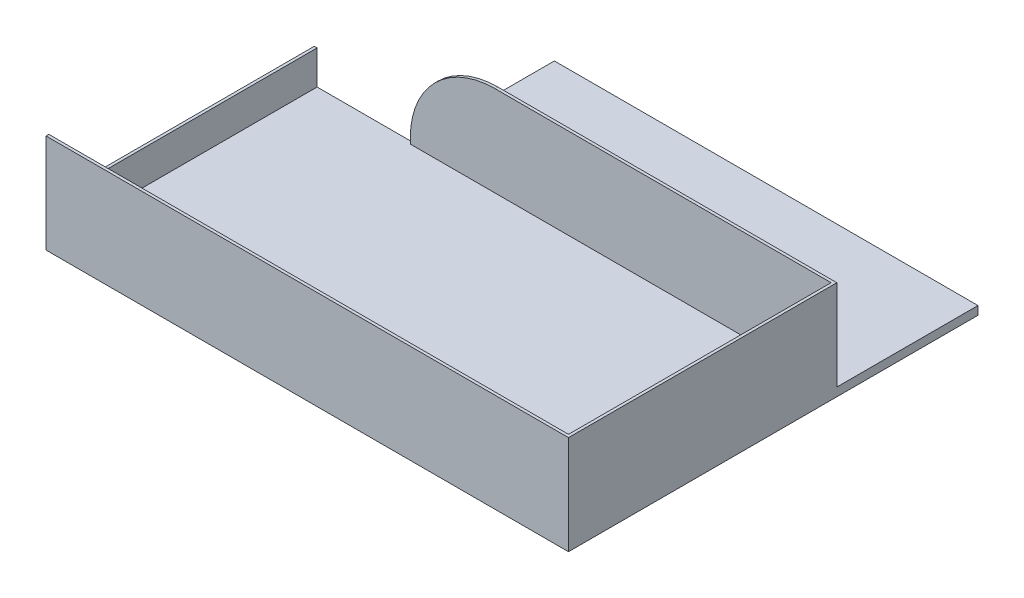
ISO-10303-21;
HEADER;
FILE_DESCRIPTION(('STEP AP214'),'2;1');
FILE_NAME('part.step','',(''),(''),'','','');
FILE_SCHEMA(('AUTOMOTIVE_DESIGN { 1 0 10303 214 1 1 1 1 }'));
ENDSEC;
DATA;
#1=APPLICATION_CONTEXT('core data for automotive mechanical design processes');
#2=APPLICATION_PROTOCOL_DEFINITION('international standard','automotive_design',2000,#1);
#3=PRODUCT_CONTEXT('',#1,'mechanical');
#4=PRODUCT('Part','Part','',(#3));
#5=PRODUCT_RELATED_PRODUCT_CATEGORY('part','',(#4));
#6=PRODUCT_DEFINITION_FORMATION('','',#4);
#7=PRODUCT_DEFINITION_CONTEXT('part definition',#1,'design');
#8=PRODUCT_DEFINITION('design','',#6,#7);
#9=PRODUCT_DEFINITION_SHAPE('','',#8);
#10=(LENGTH_UNIT() NAMED_UNIT(*) SI_UNIT(.MILLI.,.METRE.));
#11=(NAMED_UNIT(*) PLANE_ANGLE_UNIT() SI_UNIT($,.RADIAN.));
#12=(NAMED_UNIT(*) SI_UNIT($,.STERADIAN.) SOLID_ANGLE_UNIT());
#13=UNCERTAINTY_MEASURE_WITH_UNIT(LENGTH_MEASURE(1.E-05),#10,'distance_accuracy_value','');
#14=(GEOMETRIC_REPRESENTATION_CONTEXT(3) GLOBAL_UNCERTAINTY_ASSIGNED_CONTEXT((#13)) GLOBAL_UNIT_ASSIGNED_CONTEXT((#10,
#11,#12)) REPRESENTATION_CONTEXT('',''));
#15=CARTESIAN_POINT('',(0.,0.,0.));
#16=DIRECTION('',(0.,0.,1.));
#17=DIRECTION('',(1.,0.,0.));
#18=AXIS2_PLACEMENT_3D('',#15,#16,#17);
#19=CARTESIAN_POINT('',(0.,30.,0.));
#20=DIRECTION('',(0.,-1.,0.));
#21=DIRECTION('',(0.,0.,1.));
#22=AXIS2_PLACEMENT_3D('',#19,#20,#21);
#23=PLANE('',#22);
#24=DIRECTION('',(0.,0.,1.));
#25=VECTOR('',#24,1.);
#26=CARTESIAN_POINT('',(10.,30.,0.));
#27=LINE('',#26,#25);
#28=CARTESIAN_POINT('',(10.0000000000001,30.,-950.));
#29=VERTEX_POINT('',#28);
#30=CARTESIAN_POINT('',(10.,30.,-10.));
#31=VERTEX_POINT('',#30);
#32=EDGE_CURVE('E149',#29,#31,#27,.T.);
#33=ORIENTED_EDGE('',*,*,#32,.T.);
#34=DIRECTION('',(1.,0.,0.));
#35=VECTOR('',#34,1.);
#36=CARTESIAN_POINT('',(0.,30.,-10.));
#37=LINE('',#36,#35);
#38=CARTESIAN_POINT('',(1840.,30.,-10.));
#39=VERTEX_POINT('',#38);
#40=EDGE_CURVE('E236',#31,#39,#37,.T.);
#41=ORIENTED_EDGE('',*,*,#40,.T.);
#42=DIRECTION('',(0.,0.,-1.));
#43=VECTOR('',#42,1.);
#44=CARTESIAN_POINT('',(1840.,30.,0.));
#45=LINE('',#44,#43);
#46=CARTESIAN_POINT('',(1840.,30.,-940.));
#47=VERTEX_POINT('',#46);
#48=EDGE_CURVE('E233',#39,#47,#45,.T.);
#49=ORIENTED_EDGE('',*,*,#48,.T.);
#50=DIRECTION('',(1.,0.,0.));
#51=VECTOR('',#50,1.);
#52=CARTESIAN_POINT('',(350.,30.,-940.));
#53=LINE('',#52,#51);
#54=CARTESIAN_POINT('',(350.,30.,-940.));
#55=VERTEX_POINT('',#54);
#56=EDGE_CURVE('E163',#55,#47,#53,.T.);
#57=ORIENTED_EDGE('',*,*,#56,.F.);
#58=DIRECTION('',(0.,0.,-1.));
#59=VECTOR('',#58,1.);
#60=CARTESIAN_POINT('',(350.,30.,-940.));
#61=LINE('',#60,#59);
#62=CARTESIAN_POINT('',(350.,30.,-950.));
#63=VERTEX_POINT('',#62);
#64=EDGE_CURVE('E173',#55,#63,#61,.T.);
#65=ORIENTED_EDGE('',*,*,#64,.T.);
#66=DIRECTION('',(1.,0.,0.));
#67=VECTOR('',#66,1.);
#68=CARTESIAN_POINT('',(1.16341445918999E-13,30.,-950.));
#69=LINE('',#68,#67);
#70=EDGE_CURVE('E240',#29,#63,#69,.T.);
#71=ORIENTED_EDGE('',*,*,#70,.F.);
#72=EDGE_LOOP('',(#33,#41,#49,#57,#65,#71));
#73=FACE_BOUND('',#72,.T.);
#74=ADVANCED_FACE('F37',(#73),#23,.F.);
#75=DIRECTION('',(1.,0.,0.));
#76=VECTOR('',#75,1.);
#77=CARTESIAN_POINT('',(0.,30.,-950.));
#78=LINE('',#77,#76);
#79=CARTESIAN_POINT('',(1850.,30.,-950.));
#80=VERTEX_POINT('',#79);
#81=EDGE_CURVE('E195',#63,#80,#78,.T.);
#82=ORIENTED_EDGE('',*,*,#81,.T.);
#83=DIRECTION('',(0.,0.,-1.));
#84=VECTOR('',#83,1.);
#85=CARTESIAN_POINT('',(1850.,30.,-8.21565038222617E-13));
#86=LINE('',#85,#84);
#87=CARTESIAN_POINT('',(1850.,30.,-1450.));
#88=VERTEX_POINT('',#87);
#89=EDGE_CURVE('E190',#80,#88,#86,.T.);
#90=ORIENTED_EDGE('',*,*,#89,.T.);
#91=DIRECTION('',(-1.,0.,0.));
#92=VECTOR('',#91,1.);
#93=CARTESIAN_POINT('',(2.14643118094197E-13,30.,-1450.));
#94=LINE('',#93,#92);
#95=CARTESIAN_POINT('',(350.,30.,-1450.));
#96=VERTEX_POINT('',#95);
#97=EDGE_CURVE('E187',#88,#96,#94,.T.);
#98=ORIENTED_EDGE('',*,*,#97,.T.);
#99=DIRECTION('',(0.,0.,1.));
#100=VECTOR('',#99,1.);
#101=CARTESIAN_POINT('',(350.,30.,0.));
#102=LINE('',#101,#100);
#103=EDGE_CURVE('E194',#96,#63,#102,.T.);
#104=ORIENTED_EDGE('',*,*,#103,.T.);
#105=EDGE_LOOP('',(#82,#90,#98,#104));
#106=FACE_BOUND('',#105,.T.);
#107=ADVANCED_FACE('F296',(#106),#23,.F.);
#108=CARTESIAN_POINT('',(1.16341445918999E-13,30.,-950.));
#109=DIRECTION('',(0.,0.,1.));
#110=DIRECTION('',(-1.,0.,0.));
#111=AXIS2_PLACEMENT_3D('',#108,#109,#110);
#112=PLANE('',#111);
#113=DIRECTION('',(1.,0.,0.));
#114=VECTOR('',#113,1.);
#115=CARTESIAN_POINT('',(1.16341445918999E-13,0.,-950.));
#116=LINE('',#115,#114);
#117=CARTESIAN_POINT('',(1.16341445918999E-13,0.,-950.));
#118=VERTEX_POINT('',#117);
#119=CARTESIAN_POINT('',(350.,0.,-950.));
#120=VERTEX_POINT('',#119);
#121=EDGE_CURVE('E239',#118,#120,#116,.T.);
#122=ORIENTED_EDGE('',*,*,#121,.F.);
#123=DIRECTION('',(0.,-1.,0.));
#124=VECTOR('',#123,1.);
#125=CARTESIAN_POINT('',(1.16341445918999E-13,30.,-950.));
#126=LINE('',#125,#124);
#127=CARTESIAN_POINT('',(1.16341445918999E-13,150.,-950.));
#128=VERTEX_POINT('',#127);
#129=EDGE_CURVE('E155',#128,#118,#126,.T.);
#130=ORIENTED_EDGE('',*,*,#129,.F.);
#131=DIRECTION('',(-1.,0.,0.));
#132=VECTOR('',#131,1.);
#133=CARTESIAN_POINT('',(10.0000000000001,150.,-950.));
#134=LINE('',#133,#132);
#135=CARTESIAN_POINT('',(10.0000000000001,150.,-950.));
#136=VERTEX_POINT('',#135);
#137=EDGE_CURVE('E142',#136,#128,#134,.T.);
#138=ORIENTED_EDGE('',*,*,#137,.F.);
#139=DIRECTION('',(0.,1.,0.));
#140=VECTOR('',#139,1.);
#141=CARTESIAN_POINT('',(10.0000000000001,0.,-950.));
#142=LINE('',#141,#140);
#143=EDGE_CURVE('E52',#29,#136,#142,.T.);
#144=ORIENTED_EDGE('',*,*,#143,.F.);
#145=ORIENTED_EDGE('',*,*,#70,.T.);
#146=DIRECTION('',(0.,-1.,0.));
#147=VECTOR('',#146,1.);
#148=CARTESIAN_POINT('',(350.,30.,-950.));
#149=LINE('',#148,#147);
#150=EDGE_CURVE('E206',#63,#120,#149,.T.);
#151=ORIENTED_EDGE('',*,*,#150,.T.);
#152=EDGE_LOOP('',(#122,#130,#138,#144,#145,#151));
#153=FACE_BOUND('',#152,.T.);
#154=ADVANCED_FACE('F153',(#153),#112,.F.);
#155=DIRECTION('',(1.,0.,0.));
#156=VECTOR('',#155,1.);
#157=CARTESIAN_POINT('',(0.,350.,-950.));
#158=LINE('',#157,#156);
#159=CARTESIAN_POINT('',(650.000000000002,350.,-950.));
#160=VERTEX_POINT('',#159);
#161=CARTESIAN_POINT('',(1850.,350.,-950.));
#162=VERTEX_POINT('',#161);
#163=EDGE_CURVE('E218',#160,#162,#158,.T.);
#164=ORIENTED_EDGE('',*,*,#163,.T.);
#165=DIRECTION('',(0.,-1.,0.));
#166=VECTOR('',#165,1.);
#167=CARTESIAN_POINT('',(1850.,30.,-950.));
#168=LINE('',#167,#166);
#169=EDGE_CURVE('E198',#162,#80,#168,.T.);
#170=ORIENTED_EDGE('',*,*,#169,.T.);
#171=ORIENTED_EDGE('',*,*,#81,.F.);
#172=DIRECTION('',(0.,-1.,0.));
#173=VECTOR('',#172,1.);
#174=CARTESIAN_POINT('',(350.,30.,-950.));
#175=LINE('',#174,#173);
#176=CARTESIAN_POINT('',(350.,49.9999999999979,-950.));
#177=VERTEX_POINT('',#176);
#178=EDGE_CURVE('E157',#177,#63,#175,.T.);
#179=ORIENTED_EDGE('',*,*,#178,.F.);
#180=CARTESIAN_POINT('',(650.,50.,-950.));
#181=DIRECTION('',(0.,0.,1.));
#182=DIRECTION('',(-1.,0.,0.));
#183=AXIS2_PLACEMENT_3D('',#180,#181,#182);
#184=CIRCLE('',#183,300.);
#185=EDGE_CURVE('E164',#160,#177,#184,.T.);
#186=ORIENTED_EDGE('',*,*,#185,.F.);
#187=EDGE_LOOP('',(#164,#170,#171,#179,#186));
#188=FACE_BOUND('',#187,.T.);
#189=ADVANCED_FACE('F39',(#188),#112,.F.);
#190=CARTESIAN_POINT('',(1850.,30.,0.));
#191=DIRECTION('',(1.,0.,0.));
#192=DIRECTION('',(0.,0.,1.));
#193=AXIS2_PLACEMENT_3D('',#190,#191,#192);
#194=PLANE('',#193);
#195=ORIENTED_EDGE('',*,*,#169,.F.);
#196=DIRECTION('',(0.,0.,-1.));
#197=VECTOR('',#196,1.);
#198=CARTESIAN_POINT('',(1850.,350.,4.32402651696114E-13));
#199=LINE('',#198,#197);
#200=CARTESIAN_POINT('',(1850.,350.,0.));
#201=VERTEX_POINT('',#200);
#202=EDGE_CURVE('E221',#201,#162,#199,.T.);
#203=ORIENTED_EDGE('',*,*,#202,.F.);
#204=DIRECTION('',(0.,-1.,0.));
#205=VECTOR('',#204,1.);
#206=CARTESIAN_POINT('',(1850.,30.,0.));
#207=LINE('',#206,#205);
#208=CARTESIAN_POINT('',(1850.,0.,0.));
#209=VERTEX_POINT('',#208);
#210=EDGE_CURVE('E255',#201,#209,#207,.T.);
#211=ORIENTED_EDGE('',*,*,#210,.T.);
#212=DIRECTION('',(0.,0.,-1.));
#213=VECTOR('',#212,1.);
#214=CARTESIAN_POINT('',(1850.,0.,0.));
#215=LINE('',#214,#213);
#216=CARTESIAN_POINT('',(1850.,0.,-1450.));
#217=VERTEX_POINT('',#216);
#218=EDGE_CURVE('E245',#209,#217,#215,.T.);
#219=ORIENTED_EDGE('',*,*,#218,.T.);
#220=DIRECTION('',(0.,-1.,0.));
#221=VECTOR('',#220,1.);
#222=CARTESIAN_POINT('',(1850.,30.,-1450.));
#223=LINE('',#222,#221);
#224=EDGE_CURVE('E209',#88,#217,#223,.T.);
#225=ORIENTED_EDGE('',*,*,#224,.F.);
#226=ORIENTED_EDGE('',*,*,#89,.F.);
#227=EDGE_LOOP('',(#195,#203,#211,#219,#225,#226));
#228=FACE_BOUND('',#227,.T.);
#229=ADVANCED_FACE('F304',(#228),#194,.T.);
#230=CARTESIAN_POINT('',(0.,30.,0.));
#231=DIRECTION('',(0.,0.,1.));
#232=DIRECTION('',(-1.,0.,0.));
#233=AXIS2_PLACEMENT_3D('',#230,#231,#232);
#234=PLANE('',#233);
#235=DIRECTION('',(1.,0.,0.));
#236=VECTOR('',#235,1.);
#237=CARTESIAN_POINT('',(0.,0.,0.));
#238=LINE('',#237,#236);
#239=CARTESIAN_POINT('',(0.,0.,0.));
#240=VERTEX_POINT('',#239);
#241=EDGE_CURVE('E248',#240,#209,#238,.T.);
#242=ORIENTED_EDGE('',*,*,#241,.T.);
#243=ORIENTED_EDGE('',*,*,#210,.F.);
#244=DIRECTION('',(1.,0.,0.));
#245=VECTOR('',#244,1.);
#246=CARTESIAN_POINT('',(0.,350.,0.));
#247=LINE('',#246,#245);
#248=CARTESIAN_POINT('',(0.,350.,0.));
#249=VERTEX_POINT('',#248);
#250=EDGE_CURVE('E223',#249,#201,#247,.T.);
#251=ORIENTED_EDGE('',*,*,#250,.F.);
#252=DIRECTION('',(0.,-1.,0.));
#253=VECTOR('',#252,1.);
#254=CARTESIAN_POINT('',(0.,30.,0.));
#255=LINE('',#254,#253);
#256=EDGE_CURVE('E252',#249,#240,#255,.T.);
#257=ORIENTED_EDGE('',*,*,#256,.T.);
#258=EDGE_LOOP('',(#242,#243,#251,#257));
#259=FACE_BOUND('',#258,.T.);
#260=ADVANCED_FACE('F307',(#259),#234,.T.);
#261=CARTESIAN_POINT('',(0.,30.,0.));
#262=DIRECTION('',(1.,0.,0.));
#263=DIRECTION('',(0.,0.,1.));
#264=AXIS2_PLACEMENT_3D('',#261,#262,#263);
#265=PLANE('',#264);
#266=ORIENTED_EDGE('',*,*,#129,.T.);
#267=DIRECTION('',(0.,0.,-1.));
#268=VECTOR('',#267,1.);
#269=CARTESIAN_POINT('',(0.,0.,0.));
#270=LINE('',#269,#268);
#271=EDGE_CURVE('E242',#240,#118,#270,.T.);
#272=ORIENTED_EDGE('',*,*,#271,.F.);
#273=ORIENTED_EDGE('',*,*,#256,.F.);
#274=DIRECTION('',(0.,0.,-1.));
#275=VECTOR('',#274,1.);
#276=CARTESIAN_POINT('',(0.,350.,0.));
#277=LINE('',#276,#275);
#278=CARTESIAN_POINT('',(0.,350.,-10.));
#279=VERTEX_POINT('',#278);
#280=EDGE_CURVE('E225',#249,#279,#277,.T.);
#281=ORIENTED_EDGE('',*,*,#280,.T.);
#282=DIRECTION('',(0.,-1.,0.));
#283=VECTOR('',#282,1.);
#284=CARTESIAN_POINT('',(0.,350.,-10.));
#285=LINE('',#284,#283);
#286=CARTESIAN_POINT('',(0.,150.,-10.));
#287=VERTEX_POINT('',#286);
#288=EDGE_CURVE('E228',#279,#287,#285,.T.);
#289=ORIENTED_EDGE('',*,*,#288,.T.);
#290=DIRECTION('',(0.,0.,1.));
#291=VECTOR('',#290,1.);
#292=CARTESIAN_POINT('',(1.16341445918999E-13,150.,-950.));
#293=LINE('',#292,#291);
#294=EDGE_CURVE('E150',#128,#287,#293,.T.);
#295=ORIENTED_EDGE('',*,*,#294,.F.);
#296=EDGE_LOOP('',(#266,#272,#273,#281,#289,#295));
#297=FACE_BOUND('',#296,.T.);
#298=ADVANCED_FACE('F277',(#297),#265,.F.);
#299=CARTESIAN_POINT('',(0.,0.,0.));
#300=DIRECTION('',(0.,-1.,0.));
#301=DIRECTION('',(0.,0.,1.));
#302=AXIS2_PLACEMENT_3D('',#299,#300,#301);
#303=PLANE('',#302);
#304=ORIENTED_EDGE('',*,*,#241,.F.);
#305=ORIENTED_EDGE('',*,*,#271,.T.);
#306=ORIENTED_EDGE('',*,*,#121,.T.);
#307=DIRECTION('',(0.,0.,1.));
#308=VECTOR('',#307,1.);
#309=CARTESIAN_POINT('',(350.,0.,0.));
#310=LINE('',#309,#308);
#311=CARTESIAN_POINT('',(350.,0.,-1450.));
#312=VERTEX_POINT('',#311);
#313=EDGE_CURVE('E191',#312,#120,#310,.T.);
#314=ORIENTED_EDGE('',*,*,#313,.F.);
#315=DIRECTION('',(-1.,0.,0.));
#316=VECTOR('',#315,1.);
#317=CARTESIAN_POINT('',(2.14643118094197E-13,0.,-1450.));
#318=LINE('',#317,#316);
#319=EDGE_CURVE('E186',#217,#312,#318,.T.);
#320=ORIENTED_EDGE('',*,*,#319,.F.);
#321=ORIENTED_EDGE('',*,*,#218,.F.);
#322=EDGE_LOOP('',(#304,#305,#306,#314,#320,#321));
#323=FACE_BOUND('',#322,.T.);
#324=ADVANCED_FACE('F273',(#323),#303,.T.);
#325=CARTESIAN_POINT('',(0.,350.,-10.));
#326=DIRECTION('',(0.,0.,1.));
#327=DIRECTION('',(-1.,0.,0.));
#328=AXIS2_PLACEMENT_3D('',#325,#326,#327);
#329=PLANE('',#328);
#330=ORIENTED_EDGE('',*,*,#288,.F.);
#331=DIRECTION('',(1.,0.,0.));
#332=VECTOR('',#331,1.);
#333=CARTESIAN_POINT('',(0.,350.,-10.));
#334=LINE('',#333,#332);
#335=CARTESIAN_POINT('',(1840.,350.,-10.));
#336=VERTEX_POINT('',#335);
#337=EDGE_CURVE('E212',#279,#336,#334,.T.);
#338=ORIENTED_EDGE('',*,*,#337,.T.);
#339=DIRECTION('',(0.,-1.,0.));
#340=VECTOR('',#339,1.);
#341=CARTESIAN_POINT('',(1840.,350.,-10.));
#342=LINE('',#341,#340);
#343=EDGE_CURVE('E231',#336,#39,#342,.T.);
#344=ORIENTED_EDGE('',*,*,#343,.T.);
#345=ORIENTED_EDGE('',*,*,#40,.F.);
#346=DIRECTION('',(0.,1.,0.));
#347=VECTOR('',#346,1.);
#348=CARTESIAN_POINT('',(10.,350.,-10.));
#349=LINE('',#348,#347);
#350=CARTESIAN_POINT('',(10.,150.,-10.));
#351=VERTEX_POINT('',#350);
#352=EDGE_CURVE('E45',#31,#351,#349,.T.);
#353=ORIENTED_EDGE('',*,*,#352,.T.);
#354=DIRECTION('',(1.,0.,0.));
#355=VECTOR('',#354,1.);
#356=CARTESIAN_POINT('',(0.,150.,-10.));
#357=LINE('',#356,#355);
#358=EDGE_CURVE('E11',#287,#351,#357,.T.);
#359=ORIENTED_EDGE('',*,*,#358,.F.);
#360=EDGE_LOOP('',(#330,#338,#344,#345,#353,#359));
#361=FACE_BOUND('',#360,.T.);
#362=ADVANCED_FACE('F261',(#361),#329,.F.);
#363=CARTESIAN_POINT('',(1840.,350.,0.));
#364=DIRECTION('',(1.,0.,0.));
#365=DIRECTION('',(0.,0.,1.));
#366=AXIS2_PLACEMENT_3D('',#363,#364,#365);
#367=PLANE('',#366);
#368=ORIENTED_EDGE('',*,*,#48,.F.);
#369=ORIENTED_EDGE('',*,*,#343,.F.);
#370=DIRECTION('',(0.,0.,-1.));
#371=VECTOR('',#370,1.);
#372=CARTESIAN_POINT('',(1840.,350.,0.));
#373=LINE('',#372,#371);
#374=CARTESIAN_POINT('',(1840.,350.,-940.));
#375=VERTEX_POINT('',#374);
#376=EDGE_CURVE('E215',#336,#375,#373,.T.);
#377=ORIENTED_EDGE('',*,*,#376,.T.);
#378=DIRECTION('',(0.,1.,0.));
#379=VECTOR('',#378,1.);
#380=CARTESIAN_POINT('',(1840.,350.,-940.));
#381=LINE('',#380,#379);
#382=EDGE_CURVE('E179',#47,#375,#381,.T.);
#383=ORIENTED_EDGE('',*,*,#382,.F.);
#384=EDGE_LOOP('',(#368,#369,#377,#383));
#385=FACE_BOUND('',#384,.T.);
#386=ADVANCED_FACE('F282',(#385),#367,.F.);
#387=CARTESIAN_POINT('',(0.,350.,0.));
#388=DIRECTION('',(0.,1.,0.));
#389=DIRECTION('',(0.,0.,-1.));
#390=AXIS2_PLACEMENT_3D('',#387,#388,#389);
#391=PLANE('',#390);
#392=ORIENTED_EDGE('',*,*,#376,.F.);
#393=ORIENTED_EDGE('',*,*,#337,.F.);
#394=ORIENTED_EDGE('',*,*,#280,.F.);
#395=ORIENTED_EDGE('',*,*,#250,.T.);
#396=ORIENTED_EDGE('',*,*,#202,.T.);
#397=ORIENTED_EDGE('',*,*,#163,.F.);
#398=DIRECTION('',(0.,0.,-1.));
#399=VECTOR('',#398,1.);
#400=CARTESIAN_POINT('',(650.000000000002,350.,-940.));
#401=LINE('',#400,#399);
#402=CARTESIAN_POINT('',(650.000000000002,350.,-940.));
#403=VERTEX_POINT('',#402);
#404=EDGE_CURVE('E180',#403,#160,#401,.T.);
#405=ORIENTED_EDGE('',*,*,#404,.F.);
#406=DIRECTION('',(-1.,0.,0.));
#407=VECTOR('',#406,1.);
#408=CARTESIAN_POINT('',(650.000000000002,350.,-940.));
#409=LINE('',#408,#407);
#410=EDGE_CURVE('E167',#375,#403,#409,.T.);
#411=ORIENTED_EDGE('',*,*,#410,.F.);
#412=EDGE_LOOP('',(#392,#393,#394,#395,#396,#397,#405,#411));
#413=FACE_BOUND('',#412,.T.);
#414=ADVANCED_FACE('F279',(#413),#391,.T.);
#415=CARTESIAN_POINT('',(2.14643118094197E-13,30.,-1450.));
#416=DIRECTION('',(0.,0.,-1.));
#417=DIRECTION('',(1.,0.,0.));
#418=AXIS2_PLACEMENT_3D('',#415,#416,#417);
#419=PLANE('',#418);
#420=ORIENTED_EDGE('',*,*,#319,.T.);
#421=DIRECTION('',(0.,-1.,0.));
#422=VECTOR('',#421,1.);
#423=CARTESIAN_POINT('',(350.,30.,-1450.));
#424=LINE('',#423,#422);
#425=EDGE_CURVE('E201',#96,#312,#424,.T.);
#426=ORIENTED_EDGE('',*,*,#425,.F.);
#427=ORIENTED_EDGE('',*,*,#97,.F.);
#428=ORIENTED_EDGE('',*,*,#224,.T.);
#429=EDGE_LOOP('',(#420,#426,#427,#428));
#430=FACE_BOUND('',#429,.T.);
#431=ADVANCED_FACE('F300',(#430),#419,.T.);
#432=CARTESIAN_POINT('',(350.,30.,0.));
#433=DIRECTION('',(-1.,0.,0.));
#434=DIRECTION('',(0.,0.,-1.));
#435=AXIS2_PLACEMENT_3D('',#432,#433,#434);
#436=PLANE('',#435);
#437=ORIENTED_EDGE('',*,*,#313,.T.);
#438=ORIENTED_EDGE('',*,*,#150,.F.);
#439=ORIENTED_EDGE('',*,*,#103,.F.);
#440=ORIENTED_EDGE('',*,*,#425,.T.);
#441=EDGE_LOOP('',(#437,#438,#439,#440));
#442=FACE_BOUND('',#441,.T.);
#443=ADVANCED_FACE('F298',(#442),#436,.T.);
#444=CARTESIAN_POINT('',(650.,50.,-940.));
#445=DIRECTION('',(0.,0.,1.));
#446=DIRECTION('',(-1.,0.,0.));
#447=AXIS2_PLACEMENT_3D('',#444,#445,#446);
#448=PLANE('',#447);
#449=ORIENTED_EDGE('',*,*,#382,.T.);
#450=ORIENTED_EDGE('',*,*,#410,.T.);
#451=CARTESIAN_POINT('',(650.,50.,-940.));
#452=DIRECTION('',(0.,0.,1.));
#453=DIRECTION('',(-1.,0.,0.));
#454=AXIS2_PLACEMENT_3D('',#451,#452,#453);
#455=CIRCLE('',#454,300.);
#456=CARTESIAN_POINT('',(350.,49.9999999999979,-940.));
#457=VERTEX_POINT('',#456);
#458=EDGE_CURVE('E170',#403,#457,#455,.T.);
#459=ORIENTED_EDGE('',*,*,#458,.T.);
#460=DIRECTION('',(0.,-1.,0.));
#461=VECTOR('',#460,1.);
#462=CARTESIAN_POINT('',(350.,30.,-940.));
#463=LINE('',#462,#461);
#464=EDGE_CURVE('E161',#457,#55,#463,.T.);
#465=ORIENTED_EDGE('',*,*,#464,.T.);
#466=ORIENTED_EDGE('',*,*,#56,.T.);
#467=EDGE_LOOP('',(#449,#450,#459,#465,#466));
#468=FACE_BOUND('',#467,.T.);
#469=ADVANCED_FACE('F284',(#468),#448,.T.);
#470=CARTESIAN_POINT('',(350.,30.,-940.));
#471=DIRECTION('',(-1.,0.,0.));
#472=DIRECTION('',(0.,0.,-1.));
#473=AXIS2_PLACEMENT_3D('',#470,#471,#472);
#474=PLANE('',#473);
#475=ORIENTED_EDGE('',*,*,#178,.T.);
#476=ORIENTED_EDGE('',*,*,#64,.F.);
#477=ORIENTED_EDGE('',*,*,#464,.F.);
#478=DIRECTION('',(0.,0.,-1.));
#479=VECTOR('',#478,1.);
#480=CARTESIAN_POINT('',(350.,49.9999999999979,-940.));
#481=LINE('',#480,#479);
#482=EDGE_CURVE('E177',#457,#177,#481,.T.);
#483=ORIENTED_EDGE('',*,*,#482,.T.);
#484=EDGE_LOOP('',(#475,#476,#477,#483));
#485=FACE_BOUND('',#484,.T.);
#486=ADVANCED_FACE('F287',(#485),#474,.T.);
#487=CARTESIAN_POINT('',(650.,50.,-940.));
#488=DIRECTION('',(0.,0.,-1.));
#489=DIRECTION('',(1.,0.,0.));
#490=AXIS2_PLACEMENT_3D('',#487,#488,#489);
#491=CYLINDRICAL_SURFACE('',#490,300.);
#492=ORIENTED_EDGE('',*,*,#185,.T.);
#493=ORIENTED_EDGE('',*,*,#482,.F.);
#494=ORIENTED_EDGE('',*,*,#458,.F.);
#495=ORIENTED_EDGE('',*,*,#404,.T.);
#496=EDGE_LOOP('',(#492,#493,#494,#495));
#497=FACE_BOUND('',#496,.T.);
#498=ADVANCED_FACE('F309',(#497),#491,.T.);
#499=CARTESIAN_POINT('',(10.0000000000001,150.,-950.));
#500=DIRECTION('',(0.,1.,0.));
#501=DIRECTION('',(0.,0.,-1.));
#502=AXIS2_PLACEMENT_3D('',#499,#500,#501);
#503=PLANE('',#502);
#504=ORIENTED_EDGE('',*,*,#358,.T.);
#505=DIRECTION('',(0.,0.,1.));
#506=VECTOR('',#505,1.);
#507=CARTESIAN_POINT('',(10.0000000000001,150.,-950.));
#508=LINE('',#507,#506);
#509=EDGE_CURVE('E59',#136,#351,#508,.T.);
#510=ORIENTED_EDGE('',*,*,#509,.F.);
#511=ORIENTED_EDGE('',*,*,#137,.T.);
#512=ORIENTED_EDGE('',*,*,#294,.T.);
#513=EDGE_LOOP('',(#504,#510,#511,#512));
#514=FACE_BOUND('',#513,.T.);
#515=ADVANCED_FACE('F140',(#514),#503,.T.);
#516=CARTESIAN_POINT('',(10.,0.,0.));
#517=DIRECTION('',(-1.,0.,0.));
#518=DIRECTION('',(0.,0.,-1.));
#519=AXIS2_PLACEMENT_3D('',#516,#517,#518);
#520=PLANE('',#519);
#521=ORIENTED_EDGE('',*,*,#143,.T.);
#522=ORIENTED_EDGE('',*,*,#509,.T.);
#523=ORIENTED_EDGE('',*,*,#352,.F.);
#524=ORIENTED_EDGE('',*,*,#32,.F.);
#525=EDGE_LOOP('',(#521,#522,#523,#524));
#526=FACE_BOUND('',#525,.T.);
#527=ADVANCED_FACE('F147',(#526),#520,.F.);
#528=CLOSED_SHELL('',(#74,#107,#154,#189,#229,#260,#298,#324,#362,#386,#414,#431,#443,#469,#486,
#498,#515,#527));
#529=MANIFOLD_SOLID_BREP('B2',#528);
#530=ADVANCED_BREP_SHAPE_REPRESENTATION('',(#18,#529),#14);
#531=SHAPE_DEFINITION_REPRESENTATION(#9,#530);
ENDSEC;
END-ISO-10303-21;
